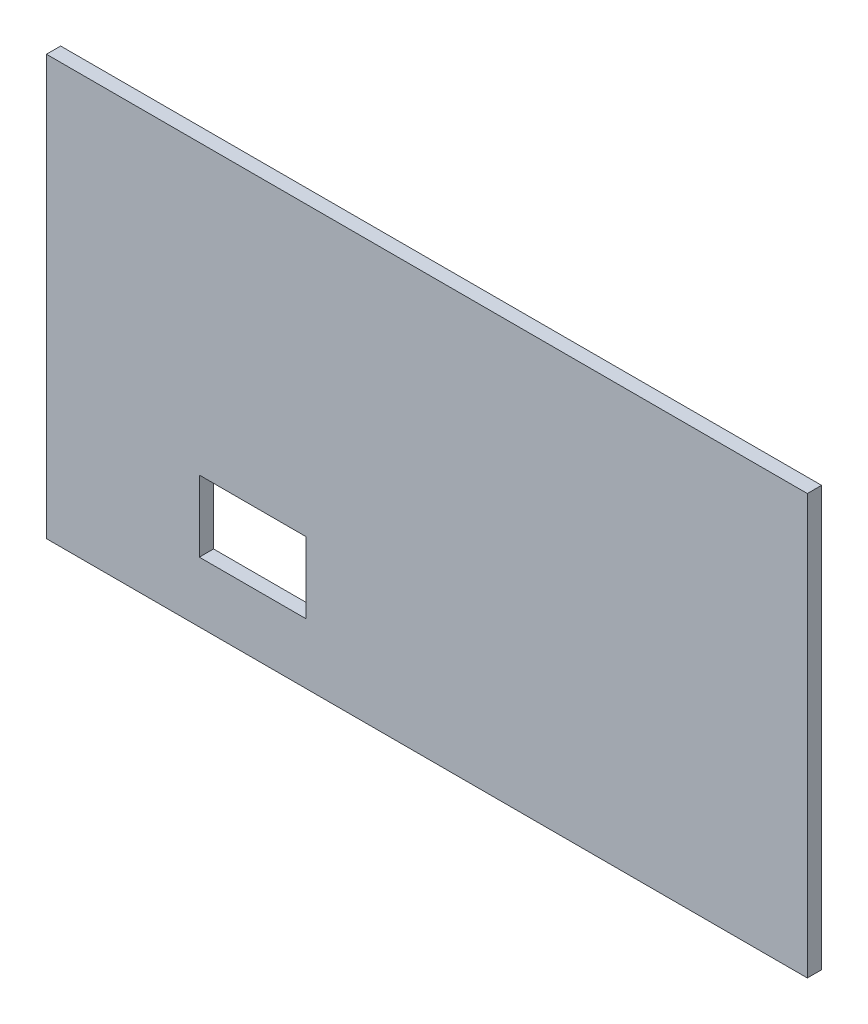
ISO-10303-21;
HEADER;
FILE_DESCRIPTION(('STEP AP214'),'2;1');
FILE_NAME('part.step','',(''),(''),'','','');
FILE_SCHEMA(('AUTOMOTIVE_DESIGN { 1 0 10303 214 1 1 1 1 }'));
ENDSEC;
DATA;
#1=APPLICATION_CONTEXT('core data for automotive mechanical design processes');
#2=APPLICATION_PROTOCOL_DEFINITION('international standard','automotive_design',2000,#1);
#3=PRODUCT_CONTEXT('',#1,'mechanical');
#4=PRODUCT('Part','Part','',(#3));
#5=PRODUCT_RELATED_PRODUCT_CATEGORY('part','',(#4));
#6=PRODUCT_DEFINITION_FORMATION('','',#4);
#7=PRODUCT_DEFINITION_CONTEXT('part definition',#1,'design');
#8=PRODUCT_DEFINITION('design','',#6,#7);
#9=PRODUCT_DEFINITION_SHAPE('','',#8);
#10=(LENGTH_UNIT() NAMED_UNIT(*) SI_UNIT(.MILLI.,.METRE.));
#11=(NAMED_UNIT(*) PLANE_ANGLE_UNIT() SI_UNIT($,.RADIAN.));
#12=(NAMED_UNIT(*) SI_UNIT($,.STERADIAN.) SOLID_ANGLE_UNIT());
#13=UNCERTAINTY_MEASURE_WITH_UNIT(LENGTH_MEASURE(1.E-05),#10,'distance_accuracy_value','');
#14=(GEOMETRIC_REPRESENTATION_CONTEXT(3) GLOBAL_UNCERTAINTY_ASSIGNED_CONTEXT((#13)) GLOBAL_UNIT_ASSIGNED_CONTEXT((#10,
#11,#12)) REPRESENTATION_CONTEXT('',''));
#15=CARTESIAN_POINT('',(0.,0.,0.));
#16=DIRECTION('',(0.,0.,1.));
#17=DIRECTION('',(1.,0.,0.));
#18=AXIS2_PLACEMENT_3D('',#15,#16,#17);
#19=CARTESIAN_POINT('',(0.,0.,2.));
#20=DIRECTION('',(0.,0.,-1.));
#21=DIRECTION('',(-1.,0.,0.));
#22=AXIS2_PLACEMENT_3D('',#19,#20,#21);
#23=PLANE('',#22);
#24=DIRECTION('',(0.,-1.,0.));
#25=VECTOR('',#24,1.);
#26=CARTESIAN_POINT('',(0.,0.,2.));
#27=LINE('',#26,#25);
#28=CARTESIAN_POINT('',(0.,59.,2.));
#29=VERTEX_POINT('',#28);
#30=CARTESIAN_POINT('',(0.,0.,2.));
#31=VERTEX_POINT('',#30);
#32=EDGE_CURVE('E134',#29,#31,#27,.T.);
#33=ORIENTED_EDGE('',*,*,#32,.T.);
#34=DIRECTION('',(1.,0.,0.));
#35=VECTOR('',#34,1.);
#36=CARTESIAN_POINT('',(0.,0.,2.));
#37=LINE('',#36,#35);
#38=CARTESIAN_POINT('',(107.,0.,2.));
#39=VERTEX_POINT('',#38);
#40=EDGE_CURVE('E137',#31,#39,#37,.T.);
#41=ORIENTED_EDGE('',*,*,#40,.T.);
#42=DIRECTION('',(0.,1.,0.));
#43=VECTOR('',#42,1.);
#44=CARTESIAN_POINT('',(107.,0.,2.));
#45=LINE('',#44,#43);
#46=CARTESIAN_POINT('',(107.,59.,2.));
#47=VERTEX_POINT('',#46);
#48=EDGE_CURVE('E140',#39,#47,#45,.T.);
#49=ORIENTED_EDGE('',*,*,#48,.T.);
#50=DIRECTION('',(-1.,0.,0.));
#51=VECTOR('',#50,1.);
#52=CARTESIAN_POINT('',(0.,59.,2.));
#53=LINE('',#52,#51);
#54=EDGE_CURVE('E142',#47,#29,#53,.T.);
#55=ORIENTED_EDGE('',*,*,#54,.T.);
#56=EDGE_LOOP('',(#33,#41,#49,#55));
#57=FACE_BOUND('',#56,.T.);
#58=DIRECTION('',(0.,-1.,0.));
#59=VECTOR('',#58,1.);
#60=CARTESIAN_POINT('',(21.5,8.5,2.));
#61=LINE('',#60,#59);
#62=CARTESIAN_POINT('',(21.5,18.5,2.));
#63=VERTEX_POINT('',#62);
#64=CARTESIAN_POINT('',(21.5,8.5,2.));
#65=VERTEX_POINT('',#64);
#66=EDGE_CURVE('E98',#63,#65,#61,.T.);
#67=ORIENTED_EDGE('',*,*,#66,.F.);
#68=DIRECTION('',(-1.,0.,0.));
#69=VECTOR('',#68,1.);
#70=CARTESIAN_POINT('',(21.5,18.5,2.));
#71=LINE('',#70,#69);
#72=CARTESIAN_POINT('',(36.5,18.5,2.));
#73=VERTEX_POINT('',#72);
#74=EDGE_CURVE('E120',#73,#63,#71,.T.);
#75=ORIENTED_EDGE('',*,*,#74,.F.);
#76=DIRECTION('',(0.,1.,0.));
#77=VECTOR('',#76,1.);
#78=CARTESIAN_POINT('',(36.5,8.5,2.));
#79=LINE('',#78,#77);
#80=CARTESIAN_POINT('',(36.5,8.5,2.));
#81=VERTEX_POINT('',#80);
#82=EDGE_CURVE('E118',#81,#73,#79,.T.);
#83=ORIENTED_EDGE('',*,*,#82,.F.);
#84=DIRECTION('',(1.,0.,0.));
#85=VECTOR('',#84,1.);
#86=CARTESIAN_POINT('',(21.5,8.5,2.));
#87=LINE('',#86,#85);
#88=EDGE_CURVE('E106',#65,#81,#87,.T.);
#89=ORIENTED_EDGE('',*,*,#88,.F.);
#90=EDGE_LOOP('',(#67,#75,#83,#89));
#91=FACE_BOUND('',#90,.T.);
#92=ADVANCED_FACE('F33',(#57,#91),#23,.F.);
#93=CARTESIAN_POINT('',(0.,0.,0.));
#94=DIRECTION('',(0.,0.,-1.));
#95=DIRECTION('',(-1.,0.,0.));
#96=AXIS2_PLACEMENT_3D('',#93,#94,#95);
#97=PLANE('',#96);
#98=DIRECTION('',(0.,-1.,0.));
#99=VECTOR('',#98,1.);
#100=CARTESIAN_POINT('',(0.,0.,0.));
#101=LINE('',#100,#99);
#102=CARTESIAN_POINT('',(0.,59.,0.));
#103=VERTEX_POINT('',#102);
#104=CARTESIAN_POINT('',(0.,0.,0.));
#105=VERTEX_POINT('',#104);
#106=EDGE_CURVE('E114',#103,#105,#101,.T.);
#107=ORIENTED_EDGE('',*,*,#106,.F.);
#108=DIRECTION('',(-1.,0.,0.));
#109=VECTOR('',#108,1.);
#110=CARTESIAN_POINT('',(0.,59.,0.));
#111=LINE('',#110,#109);
#112=CARTESIAN_POINT('',(107.,59.,0.));
#113=VERTEX_POINT('',#112);
#114=EDGE_CURVE('E138',#113,#103,#111,.T.);
#115=ORIENTED_EDGE('',*,*,#114,.F.);
#116=DIRECTION('',(0.,1.,0.));
#117=VECTOR('',#116,1.);
#118=CARTESIAN_POINT('',(107.,0.,0.));
#119=LINE('',#118,#117);
#120=CARTESIAN_POINT('',(107.,0.,0.));
#121=VERTEX_POINT('',#120);
#122=EDGE_CURVE('E149',#121,#113,#119,.T.);
#123=ORIENTED_EDGE('',*,*,#122,.F.);
#124=DIRECTION('',(1.,0.,0.));
#125=VECTOR('',#124,1.);
#126=CARTESIAN_POINT('',(0.,0.,0.));
#127=LINE('',#126,#125);
#128=EDGE_CURVE('E147',#105,#121,#127,.T.);
#129=ORIENTED_EDGE('',*,*,#128,.F.);
#130=EDGE_LOOP('',(#107,#115,#123,#129));
#131=FACE_BOUND('',#130,.T.);
#132=DIRECTION('',(-1.,0.,0.));
#133=VECTOR('',#132,1.);
#134=CARTESIAN_POINT('',(21.5,18.5,0.));
#135=LINE('',#134,#133);
#136=CARTESIAN_POINT('',(36.5,18.5,0.));
#137=VERTEX_POINT('',#136);
#138=CARTESIAN_POINT('',(21.5,18.5,0.));
#139=VERTEX_POINT('',#138);
#140=EDGE_CURVE('E107',#137,#139,#135,.T.);
#141=ORIENTED_EDGE('',*,*,#140,.T.);
#142=DIRECTION('',(0.,-1.,0.));
#143=VECTOR('',#142,1.);
#144=CARTESIAN_POINT('',(21.5,8.5,0.));
#145=LINE('',#144,#143);
#146=CARTESIAN_POINT('',(21.5,8.5,0.));
#147=VERTEX_POINT('',#146);
#148=EDGE_CURVE('E56',#139,#147,#145,.T.);
#149=ORIENTED_EDGE('',*,*,#148,.T.);
#150=DIRECTION('',(1.,0.,0.));
#151=VECTOR('',#150,1.);
#152=CARTESIAN_POINT('',(21.5,8.5,0.));
#153=LINE('',#152,#151);
#154=CARTESIAN_POINT('',(36.5,8.5,0.));
#155=VERTEX_POINT('',#154);
#156=EDGE_CURVE('E113',#147,#155,#153,.T.);
#157=ORIENTED_EDGE('',*,*,#156,.T.);
#158=DIRECTION('',(0.,1.,0.));
#159=VECTOR('',#158,1.);
#160=CARTESIAN_POINT('',(36.5,8.5,0.));
#161=LINE('',#160,#159);
#162=EDGE_CURVE('E126',#155,#137,#161,.T.);
#163=ORIENTED_EDGE('',*,*,#162,.T.);
#164=EDGE_LOOP('',(#141,#149,#157,#163));
#165=FACE_BOUND('',#164,.T.);
#166=ADVANCED_FACE('F167',(#131,#165),#97,.T.);
#167=CARTESIAN_POINT('',(0.,0.,2.));
#168=DIRECTION('',(1.,0.,0.));
#169=DIRECTION('',(0.,0.,-1.));
#170=AXIS2_PLACEMENT_3D('',#167,#168,#169);
#171=PLANE('',#170);
#172=ORIENTED_EDGE('',*,*,#106,.T.);
#173=DIRECTION('',(0.,0.,-1.));
#174=VECTOR('',#173,1.);
#175=CARTESIAN_POINT('',(0.,0.,2.));
#176=LINE('',#175,#174);
#177=EDGE_CURVE('E11',#31,#105,#176,.T.);
#178=ORIENTED_EDGE('',*,*,#177,.F.);
#179=ORIENTED_EDGE('',*,*,#32,.F.);
#180=DIRECTION('',(0.,0.,-1.));
#181=VECTOR('',#180,1.);
#182=CARTESIAN_POINT('',(0.,59.,2.));
#183=LINE('',#182,#181);
#184=EDGE_CURVE('E144',#29,#103,#183,.T.);
#185=ORIENTED_EDGE('',*,*,#184,.T.);
#186=EDGE_LOOP('',(#172,#178,#179,#185));
#187=FACE_BOUND('',#186,.T.);
#188=ADVANCED_FACE('F35',(#187),#171,.F.);
#189=CARTESIAN_POINT('',(0.,0.,2.));
#190=DIRECTION('',(0.,1.,0.));
#191=DIRECTION('',(0.,0.,1.));
#192=AXIS2_PLACEMENT_3D('',#189,#190,#191);
#193=PLANE('',#192);
#194=ORIENTED_EDGE('',*,*,#128,.T.);
#195=DIRECTION('',(0.,0.,-1.));
#196=VECTOR('',#195,1.);
#197=CARTESIAN_POINT('',(107.,0.,2.));
#198=LINE('',#197,#196);
#199=EDGE_CURVE('E41',#39,#121,#198,.T.);
#200=ORIENTED_EDGE('',*,*,#199,.F.);
#201=ORIENTED_EDGE('',*,*,#40,.F.);
#202=ORIENTED_EDGE('',*,*,#177,.T.);
#203=EDGE_LOOP('',(#194,#200,#201,#202));
#204=FACE_BOUND('',#203,.T.);
#205=ADVANCED_FACE('F177',(#204),#193,.F.);
#206=CARTESIAN_POINT('',(107.,0.,2.));
#207=DIRECTION('',(-1.,0.,0.));
#208=DIRECTION('',(0.,0.,1.));
#209=AXIS2_PLACEMENT_3D('',#206,#207,#208);
#210=PLANE('',#209);
#211=ORIENTED_EDGE('',*,*,#122,.T.);
#212=DIRECTION('',(0.,0.,-1.));
#213=VECTOR('',#212,1.);
#214=CARTESIAN_POINT('',(107.,59.,2.));
#215=LINE('',#214,#213);
#216=EDGE_CURVE('E154',#47,#113,#215,.T.);
#217=ORIENTED_EDGE('',*,*,#216,.F.);
#218=ORIENTED_EDGE('',*,*,#48,.F.);
#219=ORIENTED_EDGE('',*,*,#199,.T.);
#220=EDGE_LOOP('',(#211,#217,#218,#219));
#221=FACE_BOUND('',#220,.T.);
#222=ADVANCED_FACE('F161',(#221),#210,.F.);
#223=CARTESIAN_POINT('',(0.,59.,2.));
#224=DIRECTION('',(0.,-1.,0.));
#225=DIRECTION('',(0.,0.,-1.));
#226=AXIS2_PLACEMENT_3D('',#223,#224,#225);
#227=PLANE('',#226);
#228=ORIENTED_EDGE('',*,*,#114,.T.);
#229=ORIENTED_EDGE('',*,*,#184,.F.);
#230=ORIENTED_EDGE('',*,*,#54,.F.);
#231=ORIENTED_EDGE('',*,*,#216,.T.);
#232=EDGE_LOOP('',(#228,#229,#230,#231));
#233=FACE_BOUND('',#232,.T.);
#234=ADVANCED_FACE('F171',(#233),#227,.F.);
#235=CARTESIAN_POINT('',(21.5,8.5,2.));
#236=DIRECTION('',(1.,0.,0.));
#237=DIRECTION('',(0.,0.,-1.));
#238=AXIS2_PLACEMENT_3D('',#235,#236,#237);
#239=PLANE('',#238);
#240=ORIENTED_EDGE('',*,*,#148,.F.);
#241=DIRECTION('',(0.,0.,-1.));
#242=VECTOR('',#241,1.);
#243=CARTESIAN_POINT('',(21.5,18.5,2.));
#244=LINE('',#243,#242);
#245=EDGE_CURVE('E102',#63,#139,#244,.T.);
#246=ORIENTED_EDGE('',*,*,#245,.F.);
#247=ORIENTED_EDGE('',*,*,#66,.T.);
#248=DIRECTION('',(0.,0.,-1.));
#249=VECTOR('',#248,1.);
#250=CARTESIAN_POINT('',(21.5,8.5,2.));
#251=LINE('',#250,#249);
#252=EDGE_CURVE('E101',#65,#147,#251,.T.);
#253=ORIENTED_EDGE('',*,*,#252,.T.);
#254=EDGE_LOOP('',(#240,#246,#247,#253));
#255=FACE_BOUND('',#254,.T.);
#256=ADVANCED_FACE('F100',(#255),#239,.T.);
#257=CARTESIAN_POINT('',(21.5,8.5,2.));
#258=DIRECTION('',(0.,1.,0.));
#259=DIRECTION('',(0.,0.,1.));
#260=AXIS2_PLACEMENT_3D('',#257,#258,#259);
#261=PLANE('',#260);
#262=ORIENTED_EDGE('',*,*,#156,.F.);
#263=ORIENTED_EDGE('',*,*,#252,.F.);
#264=ORIENTED_EDGE('',*,*,#88,.T.);
#265=DIRECTION('',(0.,0.,-1.));
#266=VECTOR('',#265,1.);
#267=CARTESIAN_POINT('',(36.5,8.5,2.));
#268=LINE('',#267,#266);
#269=EDGE_CURVE('E115',#81,#155,#268,.T.);
#270=ORIENTED_EDGE('',*,*,#269,.T.);
#271=EDGE_LOOP('',(#262,#263,#264,#270));
#272=FACE_BOUND('',#271,.T.);
#273=ADVANCED_FACE('F110',(#272),#261,.T.);
#274=CARTESIAN_POINT('',(36.5,8.5,2.));
#275=DIRECTION('',(-1.,0.,0.));
#276=DIRECTION('',(0.,0.,1.));
#277=AXIS2_PLACEMENT_3D('',#274,#275,#276);
#278=PLANE('',#277);
#279=ORIENTED_EDGE('',*,*,#162,.F.);
#280=ORIENTED_EDGE('',*,*,#269,.F.);
#281=ORIENTED_EDGE('',*,*,#82,.T.);
#282=DIRECTION('',(0.,0.,-1.));
#283=VECTOR('',#282,1.);
#284=CARTESIAN_POINT('',(36.5,18.5,2.));
#285=LINE('',#284,#283);
#286=EDGE_CURVE('E48',#73,#137,#285,.T.);
#287=ORIENTED_EDGE('',*,*,#286,.T.);
#288=EDGE_LOOP('',(#279,#280,#281,#287));
#289=FACE_BOUND('',#288,.T.);
#290=ADVANCED_FACE('F200',(#289),#278,.T.);
#291=CARTESIAN_POINT('',(21.5,18.5,2.));
#292=DIRECTION('',(0.,-1.,0.));
#293=DIRECTION('',(0.,0.,-1.));
#294=AXIS2_PLACEMENT_3D('',#291,#292,#293);
#295=PLANE('',#294);
#296=ORIENTED_EDGE('',*,*,#140,.F.);
#297=ORIENTED_EDGE('',*,*,#286,.F.);
#298=ORIENTED_EDGE('',*,*,#74,.T.);
#299=ORIENTED_EDGE('',*,*,#245,.T.);
#300=EDGE_LOOP('',(#296,#297,#298,#299));
#301=FACE_BOUND('',#300,.T.);
#302=ADVANCED_FACE('F204',(#301),#295,.T.);
#303=CLOSED_SHELL('',(#92,#166,#188,#205,#222,#234,#256,#273,#290,#302));
#304=MANIFOLD_SOLID_BREP('B2',#303);
#305=ADVANCED_BREP_SHAPE_REPRESENTATION('',(#18,#304),#14);
#306=SHAPE_DEFINITION_REPRESENTATION(#9,#305);
ENDSEC;
END-ISO-10303-21;
